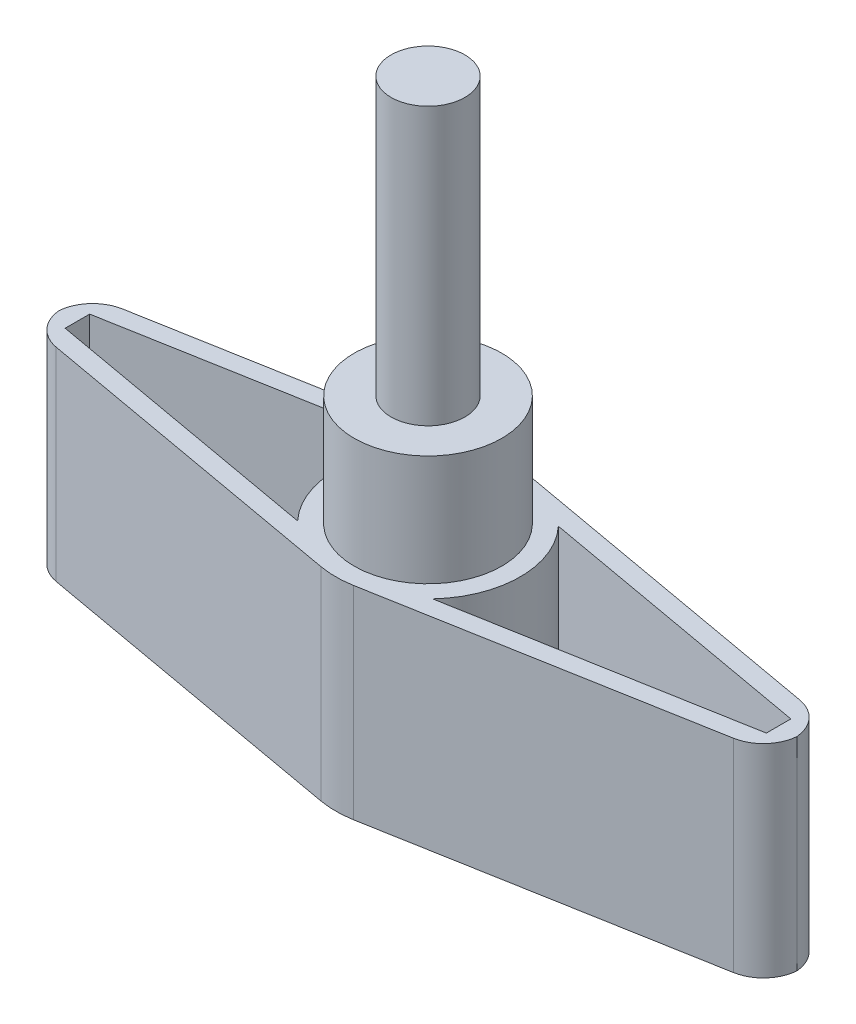
ISO-10303-21;
HEADER;
FILE_DESCRIPTION(('STEP AP214'),'2;1');
FILE_NAME('part.step','',(''),(''),'','','');
FILE_SCHEMA(('AUTOMOTIVE_DESIGN { 1 0 10303 214 1 1 1 1 }'));
ENDSEC;
DATA;
#1=APPLICATION_CONTEXT('core data for automotive mechanical design processes');
#2=APPLICATION_PROTOCOL_DEFINITION('international standard','automotive_design',2000,#1);
#3=PRODUCT_CONTEXT('',#1,'mechanical');
#4=PRODUCT('Part','Part','',(#3));
#5=PRODUCT_RELATED_PRODUCT_CATEGORY('part','',(#4));
#6=PRODUCT_DEFINITION_FORMATION('','',#4);
#7=PRODUCT_DEFINITION_CONTEXT('part definition',#1,'design');
#8=PRODUCT_DEFINITION('design','',#6,#7);
#9=PRODUCT_DEFINITION_SHAPE('','',#8);
#10=(LENGTH_UNIT() NAMED_UNIT(*) SI_UNIT(.MILLI.,.METRE.));
#11=(NAMED_UNIT(*) PLANE_ANGLE_UNIT() SI_UNIT($,.RADIAN.));
#12=(NAMED_UNIT(*) SI_UNIT($,.STERADIAN.) SOLID_ANGLE_UNIT());
#13=UNCERTAINTY_MEASURE_WITH_UNIT(LENGTH_MEASURE(1.E-05),#10,'distance_accuracy_value','');
#14=(GEOMETRIC_REPRESENTATION_CONTEXT(3) GLOBAL_UNCERTAINTY_ASSIGNED_CONTEXT((#13)) GLOBAL_UNIT_ASSIGNED_CONTEXT((#10,
#11,#12)) REPRESENTATION_CONTEXT('',''));
#15=CARTESIAN_POINT('',(0.,0.,0.));
#16=DIRECTION('',(0.,0.,1.));
#17=DIRECTION('',(1.,0.,0.));
#18=AXIS2_PLACEMENT_3D('',#15,#16,#17);
#19=CARTESIAN_POINT('',(0.,10.,0.));
#20=DIRECTION('',(0.,1.,0.));
#21=DIRECTION('',(0.,0.,1.));
#22=AXIS2_PLACEMENT_3D('',#19,#20,#21);
#23=PLANE('',#22);
#24=CARTESIAN_POINT('',(0.,10.,0.));
#25=DIRECTION('',(0.,1.,0.));
#26=DIRECTION('',(0.,0.,1.));
#27=AXIS2_PLACEMENT_3D('',#24,#25,#26);
#28=CIRCLE('',#27,4.);
#29=CARTESIAN_POINT('',(0.,10.,4.));
#30=VERTEX_POINT('',#29);
#31=EDGE_CURVE('E322',#30,#30,#28,.T.);
#32=ORIENTED_EDGE('',*,*,#31,.F.);
#33=EDGE_LOOP('',(#32));
#34=FACE_BOUND('',#33,.T.);
#35=DIRECTION('',(0.984367303622126,0.,-0.17612782732921));
#36=VECTOR('',#35,1.);
#37=CARTESIAN_POINT('',(20.0001571937306,10.,1.5008785458327));
#38=LINE('',#37,#36);
#39=CARTESIAN_POINT('',(0.880639136645933,10.,4.92183651811068));
#40=VERTEX_POINT('',#39);
#41=CARTESIAN_POINT('',(18.352412848389,10.,1.795701048034));
#42=VERTEX_POINT('',#41);
#43=EDGE_CURVE('E283',#40,#42,#38,.T.);
#44=ORIENTED_EDGE('',*,*,#43,.T.);
#45=CARTESIAN_POINT('',(18.0001571937306,10.,-0.173033559210334));
#46=DIRECTION('',(0.,1.,0.));
#47=DIRECTION('',(0.,0.,1.));
#48=AXIS2_PLACEMENT_3D('',#45,#46,#47);
#49=CIRCLE('',#48,2.);
#50=CARTESIAN_POINT('',(19.9926579810297,10.,0.));
#51=VERTEX_POINT('',#50);
#52=EDGE_CURVE('E71',#42,#51,#49,.T.);
#53=ORIENTED_EDGE('',*,*,#52,.T.);
#54=CARTESIAN_POINT('',(18.0001571937306,10.,0.173033559210389));
#55=DIRECTION('',(0.,1.,0.));
#56=DIRECTION('',(0.,0.,1.));
#57=AXIS2_PLACEMENT_3D('',#54,#55,#56);
#58=CIRCLE('',#57,2.);
#59=CARTESIAN_POINT('',(18.3524128483891,10.,-1.79570104803378));
#60=VERTEX_POINT('',#59);
#61=EDGE_CURVE('E310',#51,#60,#58,.T.);
#62=ORIENTED_EDGE('',*,*,#61,.T.);
#63=DIRECTION('',(-0.984367303622125,0.,-0.17612782732921));
#64=VECTOR('',#63,1.);
#65=CARTESIAN_POINT('',(20.0001571937306,10.,-1.50087854583253));
#66=LINE('',#65,#64);
#67=CARTESIAN_POINT('',(0.880639136645933,10.,-4.92183651811057));
#68=VERTEX_POINT('',#67);
#69=EDGE_CURVE('E285',#60,#68,#66,.T.);
#70=ORIENTED_EDGE('',*,*,#69,.T.);
#71=CARTESIAN_POINT('',(0.,10.,0.));
#72=DIRECTION('',(0.,1.,0.));
#73=DIRECTION('',(0.,0.,1.));
#74=AXIS2_PLACEMENT_3D('',#71,#72,#73);
#75=CIRCLE('',#74,5.);
#76=CARTESIAN_POINT('',(-0.880639136646155,10.,-4.92183651811057));
#77=VERTEX_POINT('',#76);
#78=EDGE_CURVE('E287',#68,#77,#75,.T.);
#79=ORIENTED_EDGE('',*,*,#78,.T.);
#80=DIRECTION('',(-0.984367303622125,0.,0.17612782732921));
#81=VECTOR('',#80,1.);
#82=CARTESIAN_POINT('',(-20.0001571937307,10.,-1.50087854583253));
#83=LINE('',#82,#81);
#84=CARTESIAN_POINT('',(-18.3524128483892,10.,-1.79570104803384));
#85=VERTEX_POINT('',#84);
#86=EDGE_CURVE('E197',#77,#85,#83,.T.);
#87=ORIENTED_EDGE('',*,*,#86,.T.);
#88=CARTESIAN_POINT('',(-18.0001571937307,10.,0.173033559210389));
#89=DIRECTION('',(0.,1.,0.));
#90=DIRECTION('',(0.,0.,1.));
#91=AXIS2_PLACEMENT_3D('',#88,#89,#90);
#92=CIRCLE('',#91,2.);
#93=CARTESIAN_POINT('',(-19.9926579810298,10.,0.));
#94=VERTEX_POINT('',#93);
#95=EDGE_CURVE('E78',#85,#94,#92,.T.);
#96=ORIENTED_EDGE('',*,*,#95,.T.);
#97=CARTESIAN_POINT('',(-18.0001571937307,10.,-0.173033559210223));
#98=DIRECTION('',(0.,1.,0.));
#99=DIRECTION('',(0.,0.,1.));
#100=AXIS2_PLACEMENT_3D('',#97,#98,#99);
#101=CIRCLE('',#100,2.);
#102=CARTESIAN_POINT('',(-18.3524128483892,10.,1.795701048034));
#103=VERTEX_POINT('',#102);
#104=EDGE_CURVE('E307',#94,#103,#101,.T.);
#105=ORIENTED_EDGE('',*,*,#104,.T.);
#106=DIRECTION('',(0.984367303622125,0.,0.176127827329209));
#107=VECTOR('',#106,1.);
#108=CARTESIAN_POINT('',(-20.0001571937306,10.,1.5008785458327));
#109=LINE('',#108,#107);
#110=CARTESIAN_POINT('',(-0.880639136646155,10.,4.92183651811068));
#111=VERTEX_POINT('',#110);
#112=EDGE_CURVE('E279',#103,#111,#109,.T.);
#113=ORIENTED_EDGE('',*,*,#112,.T.);
#114=CARTESIAN_POINT('',(0.,10.,0.));
#115=DIRECTION('',(0.,1.,0.));
#116=DIRECTION('',(0.,0.,1.));
#117=AXIS2_PLACEMENT_3D('',#114,#115,#116);
#118=CIRCLE('',#117,5.);
#119=EDGE_CURVE('E281',#111,#40,#118,.T.);
#120=ORIENTED_EDGE('',*,*,#119,.T.);
#121=EDGE_LOOP('',(#44,#53,#62,#70,#79,#87,#96,#105,#113,#120));
#122=FACE_BOUND('',#121,.T.);
#123=CARTESIAN_POINT('',(0.,10.,0.));
#124=DIRECTION('',(0.,-1.,0.));
#125=DIRECTION('',(0.,0.,1.));
#126=AXIS2_PLACEMENT_3D('',#123,#124,#125);
#127=CIRCLE('',#126,4.99999999999997);
#128=CARTESIAN_POINT('',(-3.65761322018332,10.,3.40908573250087));
#129=VERTEX_POINT('',#128);
#130=CARTESIAN_POINT('',(-3.65761322018332,10.,-3.40908573250082));
#131=VERTEX_POINT('',#130);
#132=EDGE_CURVE('E251',#129,#131,#127,.T.);
#133=ORIENTED_EDGE('',*,*,#132,.F.);
#134=DIRECTION('',(0.984367303622126,0.,0.176127827329204));
#135=VECTOR('',#134,1.);
#136=CARTESIAN_POINT('',(-18.8240293664015,10.,0.695436148270667));
#137=LINE('',#136,#135);
#138=CARTESIAN_POINT('',(-19.0001571937307,10.,0.663922493311209));
#139=VERTEX_POINT('',#138);
#140=EDGE_CURVE('E249',#139,#129,#137,.T.);
#141=ORIENTED_EDGE('',*,*,#140,.F.);
#142=DIRECTION('',(0.,0.,1.));
#143=VECTOR('',#142,1.);
#144=CARTESIAN_POINT('',(-19.0001571937307,10.,0.663922493311209));
#145=LINE('',#144,#143);
#146=CARTESIAN_POINT('',(-19.0001571937307,10.,-0.663922493311098));
#147=VERTEX_POINT('',#146);
#148=EDGE_CURVE('E257',#147,#139,#145,.T.);
#149=ORIENTED_EDGE('',*,*,#148,.F.);
#150=DIRECTION('',(-0.984367303622125,0.,0.17612782732921));
#151=VECTOR('',#150,1.);
#152=CARTESIAN_POINT('',(-18.8240293664015,10.,-0.695436148270501));
#153=LINE('',#152,#151);
#154=EDGE_CURVE('E254',#131,#147,#153,.T.);
#155=ORIENTED_EDGE('',*,*,#154,.F.);
#156=EDGE_LOOP('',(#133,#141,#149,#155));
#157=FACE_BOUND('',#156,.T.);
#158=DIRECTION('',(0.984367303622126,0.,-0.176127827329206));
#159=VECTOR('',#158,1.);
#160=CARTESIAN_POINT('',(18.8240293664013,10.,0.695436148270667));
#161=LINE('',#160,#159);
#162=CARTESIAN_POINT('',(3.6576132201831,10.,3.40908573250087));
#163=VERTEX_POINT('',#162);
#164=CARTESIAN_POINT('',(19.0001571937306,9.99999999999998,0.663922493311209));
#165=VERTEX_POINT('',#164);
#166=EDGE_CURVE('E223',#163,#165,#161,.T.);
#167=ORIENTED_EDGE('',*,*,#166,.F.);
#168=CARTESIAN_POINT('',(0.,10.,0.));
#169=DIRECTION('',(0.,-1.,0.));
#170=DIRECTION('',(0.,0.,1.));
#171=AXIS2_PLACEMENT_3D('',#168,#169,#170);
#172=CIRCLE('',#171,4.99999999999997);
#173=CARTESIAN_POINT('',(3.65761322018321,10.,-3.40908573250082));
#174=VERTEX_POINT('',#173);
#175=EDGE_CURVE('E220',#174,#163,#172,.T.);
#176=ORIENTED_EDGE('',*,*,#175,.F.);
#177=DIRECTION('',(-0.984367303622125,0.,-0.17612782732921));
#178=VECTOR('',#177,1.);
#179=CARTESIAN_POINT('',(18.8240293664013,10.,-0.695436148270612));
#180=LINE('',#179,#178);
#181=CARTESIAN_POINT('',(19.0001571937306,10.,-0.663922493311098));
#182=VERTEX_POINT('',#181);
#183=EDGE_CURVE('E218',#182,#174,#180,.T.);
#184=ORIENTED_EDGE('',*,*,#183,.F.);
#185=DIRECTION('',(0.,0.,-0.999999999999999));
#186=VECTOR('',#185,1.);
#187=CARTESIAN_POINT('',(19.0001571937306,9.99999999999998,0.663922493311209));
#188=LINE('',#187,#186);
#189=EDGE_CURVE('E225',#165,#182,#188,.T.);
#190=ORIENTED_EDGE('',*,*,#189,.F.);
#191=EDGE_LOOP('',(#167,#176,#184,#190));
#192=FACE_BOUND('',#191,.T.);
#193=ADVANCED_FACE('F54',(#34,#122,#157,#192),#23,.T.);
#194=CARTESIAN_POINT('',(-20.0001571937306,10.,1.5008785458327));
#195=DIRECTION('',(0.17612782732921,0.,-0.984367303622124));
#196=DIRECTION('',(-0.984367303622126,0.,-0.176127827329209));
#197=AXIS2_PLACEMENT_3D('',#194,#195,#196);
#198=PLANE('',#197);
#199=ORIENTED_EDGE('',*,*,#112,.F.);
#200=DIRECTION('',(0.,-1.,0.));
#201=VECTOR('',#200,1.);
#202=CARTESIAN_POINT('',(-18.3524128483892,10.,1.795701048034));
#203=LINE('',#202,#201);
#204=CARTESIAN_POINT('',(-18.3524128483892,-1.,1.795701048034));
#205=VERTEX_POINT('',#204);
#206=EDGE_CURVE('E13',#103,#205,#203,.T.);
#207=ORIENTED_EDGE('',*,*,#206,.T.);
#208=DIRECTION('',(-0.984367303622125,0.,-0.176127827329209));
#209=VECTOR('',#208,1.);
#210=CARTESIAN_POINT('',(-20.0001571937306,-1.,1.5008785458327));
#211=LINE('',#210,#209);
#212=CARTESIAN_POINT('',(-0.880639136646044,-1.,4.92183651811062));
#213=VERTEX_POINT('',#212);
#214=EDGE_CURVE('E214',#213,#205,#211,.T.);
#215=ORIENTED_EDGE('',*,*,#214,.F.);
#216=DIRECTION('',(0.,-1.,0.));
#217=VECTOR('',#216,1.);
#218=CARTESIAN_POINT('',(-0.880639136646155,10.,4.92183651811068));
#219=LINE('',#218,#217);
#220=EDGE_CURVE('E294',#111,#213,#219,.T.);
#221=ORIENTED_EDGE('',*,*,#220,.F.);
#222=EDGE_LOOP('',(#199,#207,#215,#221));
#223=FACE_BOUND('',#222,.T.);
#224=ADVANCED_FACE('F336',(#223),#198,.F.);
#225=CARTESIAN_POINT('',(0.,10.,0.));
#226=DIRECTION('',(0.,-1.,0.));
#227=DIRECTION('',(0.,0.,-1.));
#228=AXIS2_PLACEMENT_3D('',#225,#226,#227);
#229=CYLINDRICAL_SURFACE('',#228,5.);
#230=ORIENTED_EDGE('',*,*,#220,.T.);
#231=CARTESIAN_POINT('',(0.,-1.,0.));
#232=DIRECTION('',(0.,-1.,0.));
#233=DIRECTION('',(0.,0.,-1.));
#234=AXIS2_PLACEMENT_3D('',#231,#232,#233);
#235=CIRCLE('',#234,5.);
#236=CARTESIAN_POINT('',(0.880639136645933,-1.,4.92183651811068));
#237=VERTEX_POINT('',#236);
#238=EDGE_CURVE('E211',#237,#213,#235,.T.);
#239=ORIENTED_EDGE('',*,*,#238,.F.);
#240=DIRECTION('',(0.,-1.,0.));
#241=VECTOR('',#240,1.);
#242=CARTESIAN_POINT('',(0.880639136645933,10.,4.92183651811068));
#243=LINE('',#242,#241);
#244=EDGE_CURVE('E291',#40,#237,#243,.T.);
#245=ORIENTED_EDGE('',*,*,#244,.F.);
#246=ORIENTED_EDGE('',*,*,#119,.F.);
#247=EDGE_LOOP('',(#230,#239,#245,#246));
#248=FACE_BOUND('',#247,.T.);
#249=ADVANCED_FACE('F340',(#248),#229,.T.);
#250=CARTESIAN_POINT('',(20.0001571937306,10.,1.5008785458327));
#251=DIRECTION('',(-0.176127827329209,0.,-0.984367303622124));
#252=DIRECTION('',(-0.984367303622126,0.,0.17612782732921));
#253=AXIS2_PLACEMENT_3D('',#250,#251,#252);
#254=PLANE('',#253);
#255=DIRECTION('',(-0.984367303622126,0.,0.17612782732921));
#256=VECTOR('',#255,1.);
#257=CARTESIAN_POINT('',(20.0001571937306,-1.,1.5008785458327));
#258=LINE('',#257,#256);
#259=CARTESIAN_POINT('',(18.3524128483891,-1.,1.79570104803395));
#260=VERTEX_POINT('',#259);
#261=EDGE_CURVE('E206',#260,#237,#258,.T.);
#262=ORIENTED_EDGE('',*,*,#261,.F.);
#263=DIRECTION('',(0.,-1.,0.));
#264=VECTOR('',#263,1.);
#265=CARTESIAN_POINT('',(18.352412848389,10.,1.795701048034));
#266=LINE('',#265,#264);
#267=EDGE_CURVE('E304',#260,#42,#266,.F.);
#268=ORIENTED_EDGE('',*,*,#267,.T.);
#269=ORIENTED_EDGE('',*,*,#43,.F.);
#270=ORIENTED_EDGE('',*,*,#244,.T.);
#271=EDGE_LOOP('',(#262,#268,#269,#270));
#272=FACE_BOUND('',#271,.T.);
#273=ADVANCED_FACE('F346',(#272),#254,.F.);
#274=CARTESIAN_POINT('',(20.0001571937306,10.,-1.50087854583253));
#275=DIRECTION('',(-0.17612782732921,0.,0.984367303622124));
#276=DIRECTION('',(0.984367303622125,0.,0.17612782732921));
#277=AXIS2_PLACEMENT_3D('',#274,#275,#276);
#278=PLANE('',#277);
#279=ORIENTED_EDGE('',*,*,#69,.F.);
#280=DIRECTION('',(0.,-1.,0.));
#281=VECTOR('',#280,1.);
#282=CARTESIAN_POINT('',(18.3524128483891,10.,-1.79570104803378));
#283=LINE('',#282,#281);
#284=CARTESIAN_POINT('',(18.352412848389,-1.,-1.79570104803384));
#285=VERTEX_POINT('',#284);
#286=EDGE_CURVE('E313',#60,#285,#283,.T.);
#287=ORIENTED_EDGE('',*,*,#286,.T.);
#288=DIRECTION('',(0.984367303622125,0.,0.17612782732921));
#289=VECTOR('',#288,1.);
#290=CARTESIAN_POINT('',(0.880639136645933,-1.,-4.92183651811057));
#291=LINE('',#290,#289);
#292=CARTESIAN_POINT('',(0.880639136645933,-1.,-4.92183651811057));
#293=VERTEX_POINT('',#292);
#294=EDGE_CURVE('E204',#293,#285,#291,.T.);
#295=ORIENTED_EDGE('',*,*,#294,.F.);
#296=DIRECTION('',(0.,-1.,0.));
#297=VECTOR('',#296,1.);
#298=CARTESIAN_POINT('',(0.880639136645933,10.,-4.92183651811057));
#299=LINE('',#298,#297);
#300=EDGE_CURVE('E200',#68,#293,#299,.T.);
#301=ORIENTED_EDGE('',*,*,#300,.F.);
#302=EDGE_LOOP('',(#279,#287,#295,#301));
#303=FACE_BOUND('',#302,.T.);
#304=ADVANCED_FACE('F374',(#303),#278,.F.);
#305=CARTESIAN_POINT('',(0.,10.,0.));
#306=DIRECTION('',(0.,-1.,0.));
#307=DIRECTION('',(0.,0.,-1.));
#308=AXIS2_PLACEMENT_3D('',#305,#306,#307);
#309=CYLINDRICAL_SURFACE('',#308,5.);
#310=ORIENTED_EDGE('',*,*,#300,.T.);
#311=CARTESIAN_POINT('',(0.,-1.,0.));
#312=DIRECTION('',(0.,-1.,0.));
#313=DIRECTION('',(0.,0.,-1.));
#314=AXIS2_PLACEMENT_3D('',#311,#312,#313);
#315=CIRCLE('',#314,5.);
#316=CARTESIAN_POINT('',(-0.880639136646044,-1.,-4.92183651811057));
#317=VERTEX_POINT('',#316);
#318=EDGE_CURVE('E184',#317,#293,#315,.T.);
#319=ORIENTED_EDGE('',*,*,#318,.F.);
#320=DIRECTION('',(0.,-1.,0.));
#321=VECTOR('',#320,1.);
#322=CARTESIAN_POINT('',(-0.880639136646155,10.,-4.92183651811057));
#323=LINE('',#322,#321);
#324=EDGE_CURVE('E195',#77,#317,#323,.T.);
#325=ORIENTED_EDGE('',*,*,#324,.F.);
#326=ORIENTED_EDGE('',*,*,#78,.F.);
#327=EDGE_LOOP('',(#310,#319,#325,#326));
#328=FACE_BOUND('',#327,.T.);
#329=ADVANCED_FACE('F202',(#328),#309,.T.);
#330=CARTESIAN_POINT('',(-20.0001571937307,10.,-1.50087854583253));
#331=DIRECTION('',(0.17612782732921,0.,0.984367303622124));
#332=DIRECTION('',(0.984367303622125,0.,-0.17612782732921));
#333=AXIS2_PLACEMENT_3D('',#330,#331,#332);
#334=PLANE('',#333);
#335=DIRECTION('',(0.984367303622125,0.,-0.17612782732921));
#336=VECTOR('',#335,1.);
#337=CARTESIAN_POINT('',(-20.0001571937307,-1.,-1.50087854583253));
#338=LINE('',#337,#336);
#339=CARTESIAN_POINT('',(-18.3524128483893,-1.,-1.79570104803378));
#340=VERTEX_POINT('',#339);
#341=EDGE_CURVE('E179',#340,#317,#338,.T.);
#342=ORIENTED_EDGE('',*,*,#341,.F.);
#343=DIRECTION('',(0.,-1.,0.));
#344=VECTOR('',#343,1.);
#345=CARTESIAN_POINT('',(-18.3524128483892,10.,-1.79570104803384));
#346=LINE('',#345,#344);
#347=EDGE_CURVE('E63',#340,#85,#346,.F.);
#348=ORIENTED_EDGE('',*,*,#347,.T.);
#349=ORIENTED_EDGE('',*,*,#86,.F.);
#350=ORIENTED_EDGE('',*,*,#324,.T.);
#351=EDGE_LOOP('',(#342,#348,#349,#350));
#352=FACE_BOUND('',#351,.T.);
#353=ADVANCED_FACE('F196',(#352),#334,.F.);
#354=CARTESIAN_POINT('',(-18.8240293664015,10.,0.695436148270667));
#355=DIRECTION('',(0.176127827329206,0.,-0.984367303622125));
#356=DIRECTION('',(-0.984367303622126,0.,-0.176127827329205));
#357=AXIS2_PLACEMENT_3D('',#354,#355,#356);
#358=PLANE('',#357);
#359=DIRECTION('',(0.984367303622126,0.,0.176127827329205));
#360=VECTOR('',#359,1.);
#361=CARTESIAN_POINT('',(-18.8240293664014,0.,0.695436148270612));
#362=LINE('',#361,#360);
#363=CARTESIAN_POINT('',(-19.0001571937307,0.,0.663922493311209));
#364=VERTEX_POINT('',#363);
#365=CARTESIAN_POINT('',(-3.65761322018332,0.,3.40908573250087));
#366=VERTEX_POINT('',#365);
#367=EDGE_CURVE('E248',#364,#366,#362,.T.);
#368=ORIENTED_EDGE('',*,*,#367,.F.);
#369=DIRECTION('',(0.,-1.,0.));
#370=VECTOR('',#369,1.);
#371=CARTESIAN_POINT('',(-19.0001571937307,10.,0.663922493311209));
#372=LINE('',#371,#370);
#373=EDGE_CURVE('E259',#139,#364,#372,.T.);
#374=ORIENTED_EDGE('',*,*,#373,.F.);
#375=ORIENTED_EDGE('',*,*,#140,.T.);
#376=DIRECTION('',(0.,-1.,0.));
#377=VECTOR('',#376,1.);
#378=CARTESIAN_POINT('',(-3.65761322018332,10.,3.40908573250087));
#379=LINE('',#378,#377);
#380=EDGE_CURVE('E277',#129,#366,#379,.T.);
#381=ORIENTED_EDGE('',*,*,#380,.T.);
#382=EDGE_LOOP('',(#368,#374,#375,#381));
#383=FACE_BOUND('',#382,.T.);
#384=ADVANCED_FACE('F368',(#383),#358,.T.);
#385=CARTESIAN_POINT('',(0.,10.,0.));
#386=DIRECTION('',(0.,-1.,0.));
#387=DIRECTION('',(0.,0.,-1.));
#388=AXIS2_PLACEMENT_3D('',#385,#386,#387);
#389=CYLINDRICAL_SURFACE('',#388,4.99999999999997);
#390=CARTESIAN_POINT('',(0.,0.,0.));
#391=DIRECTION('',(0.,-1.,0.));
#392=DIRECTION('',(0.,0.,1.));
#393=AXIS2_PLACEMENT_3D('',#390,#391,#392);
#394=CIRCLE('',#393,4.99999999999997);
#395=CARTESIAN_POINT('',(-3.65761322018332,0.,-3.40908573250082));
#396=VERTEX_POINT('',#395);
#397=EDGE_CURVE('E262',#366,#396,#394,.T.);
#398=ORIENTED_EDGE('',*,*,#397,.F.);
#399=ORIENTED_EDGE('',*,*,#380,.F.);
#400=ORIENTED_EDGE('',*,*,#132,.T.);
#401=DIRECTION('',(0.,-1.,0.));
#402=VECTOR('',#401,1.);
#403=CARTESIAN_POINT('',(-3.65761322018332,10.,-3.40908573250082));
#404=LINE('',#403,#402);
#405=EDGE_CURVE('E274',#131,#396,#404,.T.);
#406=ORIENTED_EDGE('',*,*,#405,.T.);
#407=EDGE_LOOP('',(#398,#399,#400,#406));
#408=FACE_BOUND('',#407,.T.);
#409=ADVANCED_FACE('F407',(#408),#389,.T.);
#410=CARTESIAN_POINT('',(-18.8240293664015,10.,-0.695436148270501));
#411=DIRECTION('',(0.176127827329209,0.,0.984367303622124));
#412=DIRECTION('',(0.984367303622126,0.,-0.176127827329209));
#413=AXIS2_PLACEMENT_3D('',#410,#411,#412);
#414=PLANE('',#413);
#415=DIRECTION('',(-0.984367303622126,0.,0.176127827329209));
#416=VECTOR('',#415,1.);
#417=CARTESIAN_POINT('',(-18.8240293664015,0.,-0.695436148270501));
#418=LINE('',#417,#416);
#419=CARTESIAN_POINT('',(-19.0001571937307,0.,-0.663922493311042));
#420=VERTEX_POINT('',#419);
#421=EDGE_CURVE('E265',#396,#420,#418,.T.);
#422=ORIENTED_EDGE('',*,*,#421,.F.);
#423=ORIENTED_EDGE('',*,*,#405,.F.);
#424=ORIENTED_EDGE('',*,*,#154,.T.);
#425=DIRECTION('',(0.,-1.,0.));
#426=VECTOR('',#425,1.);
#427=CARTESIAN_POINT('',(-19.0001571937307,10.,-0.663922493311098));
#428=LINE('',#427,#426);
#429=EDGE_CURVE('E272',#147,#420,#428,.T.);
#430=ORIENTED_EDGE('',*,*,#429,.T.);
#431=EDGE_LOOP('',(#422,#423,#424,#430));
#432=FACE_BOUND('',#431,.T.);
#433=ADVANCED_FACE('F414',(#432),#414,.T.);
#434=CARTESIAN_POINT('',(-19.0001571937307,10.,0.663922493311209));
#435=DIRECTION('',(1.,0.,0.));
#436=DIRECTION('',(0.,0.,-1.));
#437=AXIS2_PLACEMENT_3D('',#434,#435,#436);
#438=PLANE('',#437);
#439=DIRECTION('',(0.,0.,1.));
#440=VECTOR('',#439,1.);
#441=CARTESIAN_POINT('',(-19.0001571937307,0.,0.663922493311209));
#442=LINE('',#441,#440);
#443=EDGE_CURVE('E252',#420,#364,#442,.T.);
#444=ORIENTED_EDGE('',*,*,#443,.F.);
#445=ORIENTED_EDGE('',*,*,#429,.F.);
#446=ORIENTED_EDGE('',*,*,#148,.T.);
#447=ORIENTED_EDGE('',*,*,#373,.T.);
#448=EDGE_LOOP('',(#444,#445,#446,#447));
#449=FACE_BOUND('',#448,.T.);
#450=ADVANCED_FACE('F421',(#449),#438,.T.);
#451=CARTESIAN_POINT('',(0.,10.,0.));
#452=DIRECTION('',(0.,-1.,0.));
#453=DIRECTION('',(0.,0.,-1.));
#454=AXIS2_PLACEMENT_3D('',#451,#452,#453);
#455=CYLINDRICAL_SURFACE('',#454,4.99999999999997);
#456=CARTESIAN_POINT('',(0.,0.,0.));
#457=DIRECTION('',(0.,-1.,0.));
#458=DIRECTION('',(0.,0.,1.));
#459=AXIS2_PLACEMENT_3D('',#456,#457,#458);
#460=CIRCLE('',#459,4.99999999999997);
#461=CARTESIAN_POINT('',(3.65761322018321,0.,-3.40908573250082));
#462=VERTEX_POINT('',#461);
#463=CARTESIAN_POINT('',(3.65761322018321,0.,3.40908573250082));
#464=VERTEX_POINT('',#463);
#465=EDGE_CURVE('E217',#462,#464,#460,.T.);
#466=ORIENTED_EDGE('',*,*,#465,.F.);
#467=DIRECTION('',(0.,-1.,0.));
#468=VECTOR('',#467,1.);
#469=CARTESIAN_POINT('',(3.65761322018321,10.,-3.40908573250082));
#470=LINE('',#469,#468);
#471=EDGE_CURVE('E245',#174,#462,#470,.T.);
#472=ORIENTED_EDGE('',*,*,#471,.F.);
#473=ORIENTED_EDGE('',*,*,#175,.T.);
#474=DIRECTION('',(0.,-1.,0.));
#475=VECTOR('',#474,1.);
#476=CARTESIAN_POINT('',(3.6576132201831,10.,3.40908573250087));
#477=LINE('',#476,#475);
#478=EDGE_CURVE('E242',#163,#464,#477,.T.);
#479=ORIENTED_EDGE('',*,*,#478,.T.);
#480=EDGE_LOOP('',(#466,#472,#473,#479));
#481=FACE_BOUND('',#480,.T.);
#482=ADVANCED_FACE('F429',(#481),#455,.T.);
#483=CARTESIAN_POINT('',(18.8240293664013,10.,0.695436148270667));
#484=DIRECTION('',(-0.176127827329204,0.,-0.984367303622125));
#485=DIRECTION('',(-0.984367303622127,0.,0.176127827329204));
#486=AXIS2_PLACEMENT_3D('',#483,#484,#485);
#487=PLANE('',#486);
#488=DIRECTION('',(0.984367303622127,0.,-0.176127827329204));
#489=VECTOR('',#488,1.);
#490=CARTESIAN_POINT('',(18.8240293664014,0.,0.695436148270612));
#491=LINE('',#490,#489);
#492=CARTESIAN_POINT('',(19.0001571937307,0.,0.663922493311153));
#493=VERTEX_POINT('',#492);
#494=EDGE_CURVE('E231',#464,#493,#491,.T.);
#495=ORIENTED_EDGE('',*,*,#494,.F.);
#496=ORIENTED_EDGE('',*,*,#478,.F.);
#497=ORIENTED_EDGE('',*,*,#166,.T.);
#498=DIRECTION('',(0.,-1.,0.));
#499=VECTOR('',#498,1.);
#500=CARTESIAN_POINT('',(19.0001571937306,9.99999999999998,0.663922493311209));
#501=LINE('',#500,#499);
#502=EDGE_CURVE('E240',#165,#493,#501,.T.);
#503=ORIENTED_EDGE('',*,*,#502,.T.);
#504=EDGE_LOOP('',(#495,#496,#497,#503));
#505=FACE_BOUND('',#504,.T.);
#506=ADVANCED_FACE('F437',(#505),#487,.T.);
#507=CARTESIAN_POINT('',(19.0001571937306,9.99999999999998,0.663922493311209));
#508=DIRECTION('',(-1.,0.,0.));
#509=DIRECTION('',(0.,0.,0.999999999999999));
#510=AXIS2_PLACEMENT_3D('',#507,#508,#509);
#511=PLANE('',#510);
#512=DIRECTION('',(0.,0.,-0.999999999999999));
#513=VECTOR('',#512,1.);
#514=CARTESIAN_POINT('',(19.0001571937307,0.,0.663922493311153));
#515=LINE('',#514,#513);
#516=CARTESIAN_POINT('',(19.0001571937306,0.,-0.663922493311098));
#517=VERTEX_POINT('',#516);
#518=EDGE_CURVE('E234',#493,#517,#515,.T.);
#519=ORIENTED_EDGE('',*,*,#518,.F.);
#520=ORIENTED_EDGE('',*,*,#502,.F.);
#521=ORIENTED_EDGE('',*,*,#189,.T.);
#522=DIRECTION('',(0.,-1.,0.));
#523=VECTOR('',#522,1.);
#524=CARTESIAN_POINT('',(19.0001571937306,10.,-0.663922493311098));
#525=LINE('',#524,#523);
#526=EDGE_CURVE('E228',#182,#517,#525,.T.);
#527=ORIENTED_EDGE('',*,*,#526,.T.);
#528=EDGE_LOOP('',(#519,#520,#521,#527));
#529=FACE_BOUND('',#528,.T.);
#530=ADVANCED_FACE('F445',(#529),#511,.T.);
#531=CARTESIAN_POINT('',(18.8240293664013,10.,-0.695436148270612));
#532=DIRECTION('',(-0.176127827329209,0.,0.984367303622124));
#533=DIRECTION('',(0.984367303622125,0.,0.176127827329209));
#534=AXIS2_PLACEMENT_3D('',#531,#532,#533);
#535=PLANE('',#534);
#536=DIRECTION('',(-0.984367303622125,0.,-0.176127827329209));
#537=VECTOR('',#536,1.);
#538=CARTESIAN_POINT('',(18.8240293664015,0.,-0.695436148270556));
#539=LINE('',#538,#537);
#540=EDGE_CURVE('E221',#517,#462,#539,.T.);
#541=ORIENTED_EDGE('',*,*,#540,.F.);
#542=ORIENTED_EDGE('',*,*,#526,.F.);
#543=ORIENTED_EDGE('',*,*,#183,.T.);
#544=ORIENTED_EDGE('',*,*,#471,.T.);
#545=EDGE_LOOP('',(#541,#542,#543,#544));
#546=FACE_BOUND('',#545,.T.);
#547=ADVANCED_FACE('F453',(#546),#535,.T.);
#548=CARTESIAN_POINT('',(0.,0.,0.));
#549=DIRECTION('',(0.,-1.,0.));
#550=DIRECTION('',(0.,0.,-1.));
#551=AXIS2_PLACEMENT_3D('',#548,#549,#550);
#552=PLANE('',#551);
#553=ORIENTED_EDGE('',*,*,#540,.T.);
#554=ORIENTED_EDGE('',*,*,#465,.T.);
#555=ORIENTED_EDGE('',*,*,#494,.T.);
#556=ORIENTED_EDGE('',*,*,#518,.T.);
#557=EDGE_LOOP('',(#553,#554,#555,#556));
#558=FACE_BOUND('',#557,.T.);
#559=ADVANCED_FACE('F461',(#558),#552,.F.);
#560=ORIENTED_EDGE('',*,*,#443,.T.);
#561=ORIENTED_EDGE('',*,*,#367,.T.);
#562=ORIENTED_EDGE('',*,*,#397,.T.);
#563=ORIENTED_EDGE('',*,*,#421,.T.);
#564=EDGE_LOOP('',(#560,#561,#562,#563));
#565=FACE_BOUND('',#564,.T.);
#566=ADVANCED_FACE('F469',(#565),#552,.F.);
#567=CARTESIAN_POINT('',(0.,-1.,0.));
#568=DIRECTION('',(0.,-1.,0.));
#569=DIRECTION('',(0.,0.,-1.));
#570=AXIS2_PLACEMENT_3D('',#567,#568,#569);
#571=PLANE('',#570);
#572=CARTESIAN_POINT('',(18.0001571937306,-1.,0.173033559210334));
#573=DIRECTION('',(0.,-1.,0.));
#574=DIRECTION('',(0.,0.,-1.));
#575=AXIS2_PLACEMENT_3D('',#572,#573,#574);
#576=CIRCLE('',#575,2.);
#577=CARTESIAN_POINT('',(19.9926579810294,-1.,0.));
#578=VERTEX_POINT('',#577);
#579=EDGE_CURVE('E300',#285,#578,#576,.T.);
#580=ORIENTED_EDGE('',*,*,#579,.T.);
#581=CARTESIAN_POINT('',(18.0001571937306,-1.,-0.173033559210334));
#582=DIRECTION('',(0.,-1.,0.));
#583=DIRECTION('',(0.,0.,-1.));
#584=AXIS2_PLACEMENT_3D('',#581,#582,#583);
#585=CIRCLE('',#584,2.);
#586=EDGE_CURVE('E302',#578,#260,#585,.T.);
#587=ORIENTED_EDGE('',*,*,#586,.T.);
#588=ORIENTED_EDGE('',*,*,#261,.T.);
#589=ORIENTED_EDGE('',*,*,#238,.T.);
#590=ORIENTED_EDGE('',*,*,#214,.T.);
#591=CARTESIAN_POINT('',(-18.0001571937307,-1.,-0.173033559210278));
#592=DIRECTION('',(0.,-1.,0.));
#593=DIRECTION('',(0.,0.,-1.));
#594=AXIS2_PLACEMENT_3D('',#591,#592,#593);
#595=CIRCLE('',#594,2.);
#596=CARTESIAN_POINT('',(-19.9926579810298,-1.,0.));
#597=VERTEX_POINT('',#596);
#598=EDGE_CURVE('E297',#205,#597,#595,.T.);
#599=ORIENTED_EDGE('',*,*,#598,.T.);
#600=CARTESIAN_POINT('',(-18.0001571937307,-1.,0.173033559210389));
#601=DIRECTION('',(0.,-1.,0.));
#602=DIRECTION('',(0.,0.,-1.));
#603=AXIS2_PLACEMENT_3D('',#600,#601,#602);
#604=CIRCLE('',#603,2.);
#605=EDGE_CURVE('E187',#597,#340,#604,.T.);
#606=ORIENTED_EDGE('',*,*,#605,.T.);
#607=ORIENTED_EDGE('',*,*,#341,.T.);
#608=ORIENTED_EDGE('',*,*,#318,.T.);
#609=ORIENTED_EDGE('',*,*,#294,.T.);
#610=EDGE_LOOP('',(#580,#587,#588,#589,#590,#599,#606,#607,#608,#609));
#611=FACE_BOUND('',#610,.T.);
#612=ADVANCED_FACE('F181',(#611),#571,.T.);
#613=CARTESIAN_POINT('',(0.,16.,0.));
#614=DIRECTION('',(0.,-1.,0.));
#615=DIRECTION('',(0.,0.,-1.));
#616=AXIS2_PLACEMENT_3D('',#613,#614,#615);
#617=CYLINDRICAL_SURFACE('',#616,4.);
#618=CARTESIAN_POINT('',(0.,16.,0.));
#619=DIRECTION('',(0.,1.,0.));
#620=DIRECTION('',(0.,0.,1.));
#621=AXIS2_PLACEMENT_3D('',#618,#619,#620);
#622=CIRCLE('',#621,4.);
#623=CARTESIAN_POINT('',(0.,16.,4.));
#624=VERTEX_POINT('',#623);
#625=EDGE_CURVE('E191',#624,#624,#622,.T.);
#626=ORIENTED_EDGE('',*,*,#625,.F.);
#627=EDGE_LOOP('',(#626));
#628=FACE_BOUND('',#627,.T.);
#629=ORIENTED_EDGE('',*,*,#31,.T.);
#630=EDGE_LOOP('',(#629));
#631=FACE_BOUND('',#630,.T.);
#632=ADVANCED_FACE('F483',(#628,#631),#617,.T.);
#633=CARTESIAN_POINT('',(0.,16.,0.));
#634=DIRECTION('',(0.,1.,0.));
#635=DIRECTION('',(0.,0.,1.));
#636=AXIS2_PLACEMENT_3D('',#633,#634,#635);
#637=PLANE('',#636);
#638=CARTESIAN_POINT('',(0.,16.,0.));
#639=DIRECTION('',(0.,1.,0.));
#640=DIRECTION('',(0.,0.,1.));
#641=AXIS2_PLACEMENT_3D('',#638,#639,#640);
#642=CIRCLE('',#641,2.);
#643=CARTESIAN_POINT('',(0.,16.,2.));
#644=VERTEX_POINT('',#643);
#645=EDGE_CURVE('E296',#644,#644,#642,.T.);
#646=ORIENTED_EDGE('',*,*,#645,.F.);
#647=EDGE_LOOP('',(#646));
#648=FACE_BOUND('',#647,.T.);
#649=ORIENTED_EDGE('',*,*,#625,.T.);
#650=EDGE_LOOP('',(#649));
#651=FACE_BOUND('',#650,.T.);
#652=ADVANCED_FACE('F490',(#648,#651),#637,.T.);
#653=CARTESIAN_POINT('',(0.,31.,0.));
#654=DIRECTION('',(0.,-1.,0.));
#655=DIRECTION('',(0.,0.,-1.));
#656=AXIS2_PLACEMENT_3D('',#653,#654,#655);
#657=CYLINDRICAL_SURFACE('',#656,2.);
#658=CARTESIAN_POINT('',(0.,31.,0.));
#659=DIRECTION('',(0.,1.,0.));
#660=DIRECTION('',(0.,0.,1.));
#661=AXIS2_PLACEMENT_3D('',#658,#659,#660);
#662=CIRCLE('',#661,2.);
#663=CARTESIAN_POINT('',(0.,31.,2.));
#664=VERTEX_POINT('',#663);
#665=EDGE_CURVE('E317',#664,#664,#662,.T.);
#666=ORIENTED_EDGE('',*,*,#665,.F.);
#667=EDGE_LOOP('',(#666));
#668=FACE_BOUND('',#667,.T.);
#669=ORIENTED_EDGE('',*,*,#645,.T.);
#670=EDGE_LOOP('',(#669));
#671=FACE_BOUND('',#670,.T.);
#672=ADVANCED_FACE('F498',(#668,#671),#657,.T.);
#673=CARTESIAN_POINT('',(0.,31.,0.));
#674=DIRECTION('',(0.,1.,0.));
#675=DIRECTION('',(0.,0.,1.));
#676=AXIS2_PLACEMENT_3D('',#673,#674,#675);
#677=PLANE('',#676);
#678=ORIENTED_EDGE('',*,*,#665,.T.);
#679=EDGE_LOOP('',(#678));
#680=FACE_BOUND('',#679,.T.);
#681=ADVANCED_FACE('F355',(#680),#677,.T.);
#682=CARTESIAN_POINT('',(18.0001571937306,10.,0.173033559210389));
#683=DIRECTION('',(0.,-1.,0.));
#684=DIRECTION('',(0.,0.,-1.));
#685=AXIS2_PLACEMENT_3D('',#682,#683,#684);
#686=CYLINDRICAL_SURFACE('',#685,2.);
#687=ORIENTED_EDGE('',*,*,#286,.F.);
#688=ORIENTED_EDGE('',*,*,#61,.F.);
#689=DIRECTION('',(0.,-1.,0.));
#690=VECTOR('',#689,1.);
#691=CARTESIAN_POINT('',(19.9926579810297,4.5,0.));
#692=LINE('',#691,#690);
#693=EDGE_CURVE('E315',#578,#51,#692,.F.);
#694=ORIENTED_EDGE('',*,*,#693,.F.);
#695=ORIENTED_EDGE('',*,*,#579,.F.);
#696=EDGE_LOOP('',(#687,#688,#694,#695));
#697=FACE_BOUND('',#696,.T.);
#698=ADVANCED_FACE('F349',(#697),#686,.T.);
#699=CARTESIAN_POINT('',(18.0001571937306,10.,-0.173033559210334));
#700=DIRECTION('',(0.,-1.,0.));
#701=DIRECTION('',(0.,0.,-1.));
#702=AXIS2_PLACEMENT_3D('',#699,#700,#701);
#703=CYLINDRICAL_SURFACE('',#702,2.);
#704=ORIENTED_EDGE('',*,*,#52,.F.);
#705=ORIENTED_EDGE('',*,*,#267,.F.);
#706=ORIENTED_EDGE('',*,*,#586,.F.);
#707=ORIENTED_EDGE('',*,*,#693,.T.);
#708=EDGE_LOOP('',(#704,#705,#706,#707));
#709=FACE_BOUND('',#708,.T.);
#710=ADVANCED_FACE('F347',(#709),#703,.T.);
#711=CARTESIAN_POINT('',(-18.0001571937307,10.,-0.173033559210223));
#712=DIRECTION('',(0.,-1.,0.));
#713=DIRECTION('',(0.,0.,-1.));
#714=AXIS2_PLACEMENT_3D('',#711,#712,#713);
#715=CYLINDRICAL_SURFACE('',#714,2.);
#716=ORIENTED_EDGE('',*,*,#206,.F.);
#717=ORIENTED_EDGE('',*,*,#104,.F.);
#718=DIRECTION('',(0.,-1.,0.));
#719=VECTOR('',#718,1.);
#720=CARTESIAN_POINT('',(-19.9926579810296,4.5,0.));
#721=LINE('',#720,#719);
#722=EDGE_CURVE('E58',#597,#94,#721,.F.);
#723=ORIENTED_EDGE('',*,*,#722,.F.);
#724=ORIENTED_EDGE('',*,*,#598,.F.);
#725=EDGE_LOOP('',(#716,#717,#723,#724));
#726=FACE_BOUND('',#725,.T.);
#727=ADVANCED_FACE('F56',(#726),#715,.T.);
#728=CARTESIAN_POINT('',(-18.0001571937307,10.,0.173033559210389));
#729=DIRECTION('',(0.,-1.,0.));
#730=DIRECTION('',(0.,0.,-1.));
#731=AXIS2_PLACEMENT_3D('',#728,#729,#730);
#732=CYLINDRICAL_SURFACE('',#731,2.);
#733=ORIENTED_EDGE('',*,*,#95,.F.);
#734=ORIENTED_EDGE('',*,*,#347,.F.);
#735=ORIENTED_EDGE('',*,*,#605,.F.);
#736=ORIENTED_EDGE('',*,*,#722,.T.);
#737=EDGE_LOOP('',(#733,#734,#735,#736));
#738=FACE_BOUND('',#737,.T.);
#739=ADVANCED_FACE('F327',(#738),#732,.T.);
#740=CLOSED_SHELL('',(#193,#224,#249,#273,#304,#329,#353,#384,#409,#433,#450,#482,#506,#530,
#547,#559,#566,#612,#632,#652,#672,#681,#698,#710,#727,#739));
#741=MANIFOLD_SOLID_BREP('B2',#740);
#742=ADVANCED_BREP_SHAPE_REPRESENTATION('',(#18,#741),#14);
#743=SHAPE_DEFINITION_REPRESENTATION(#9,#742);
ENDSEC;
END-ISO-10303-21;
